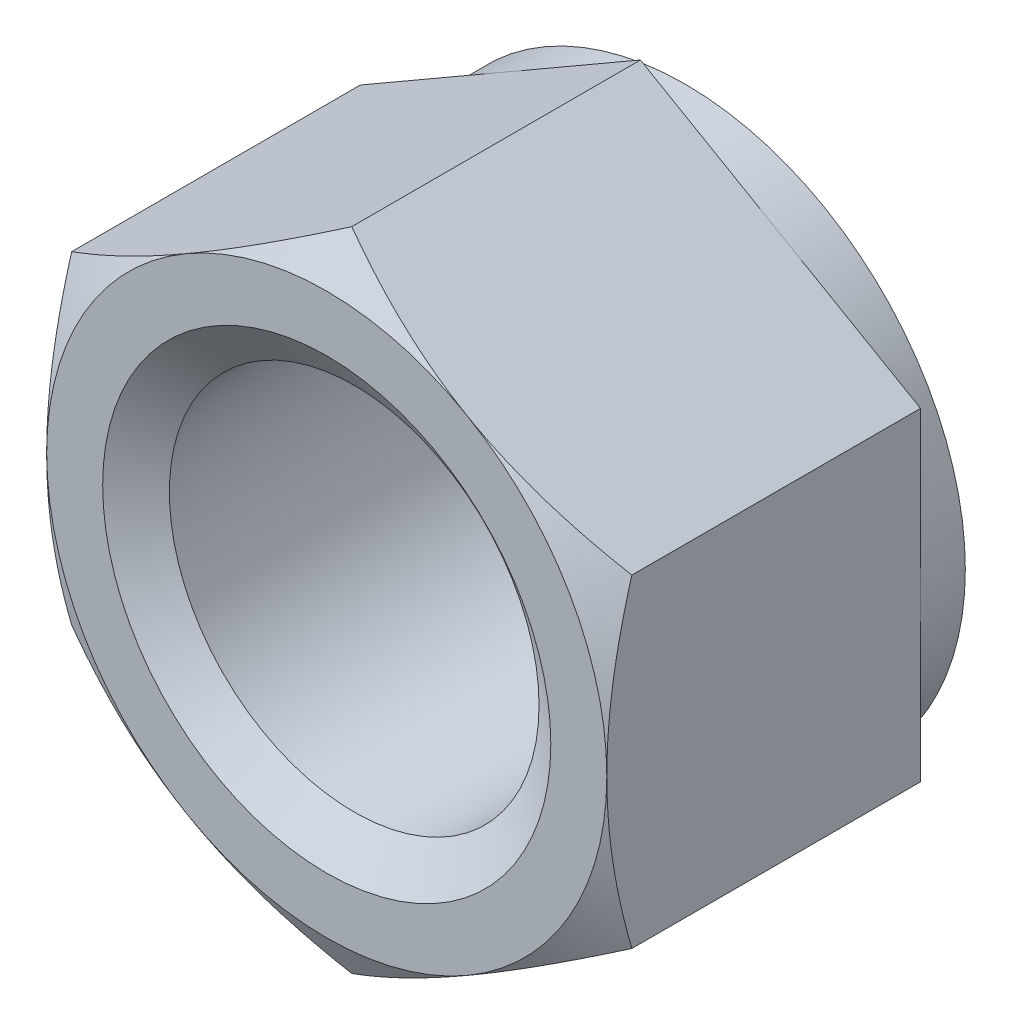
ISO-10303-21;
HEADER;
FILE_DESCRIPTION(('STEP AP214'),'2;1');
FILE_NAME('part.step','',(''),(''),'','','');
FILE_SCHEMA(('AUTOMOTIVE_DESIGN { 1 0 10303 214 1 1 1 1 }'));
ENDSEC;
DATA;
#1=APPLICATION_CONTEXT('core data for automotive mechanical design processes');
#2=APPLICATION_PROTOCOL_DEFINITION('international standard','automotive_design',2000,#1);
#3=PRODUCT_CONTEXT('',#1,'mechanical');
#4=PRODUCT('Part','Part','',(#3));
#5=PRODUCT_RELATED_PRODUCT_CATEGORY('part','',(#4));
#6=PRODUCT_DEFINITION_FORMATION('','',#4);
#7=PRODUCT_DEFINITION_CONTEXT('part definition',#1,'design');
#8=PRODUCT_DEFINITION('design','',#6,#7);
#9=PRODUCT_DEFINITION_SHAPE('','',#8);
#10=(LENGTH_UNIT() NAMED_UNIT(*) SI_UNIT(.MILLI.,.METRE.));
#11=(NAMED_UNIT(*) PLANE_ANGLE_UNIT() SI_UNIT($,.RADIAN.));
#12=(NAMED_UNIT(*) SI_UNIT($,.STERADIAN.) SOLID_ANGLE_UNIT());
#13=UNCERTAINTY_MEASURE_WITH_UNIT(LENGTH_MEASURE(1.E-05),#10,'distance_accuracy_value','');
#14=(GEOMETRIC_REPRESENTATION_CONTEXT(3) GLOBAL_UNCERTAINTY_ASSIGNED_CONTEXT((#13)) GLOBAL_UNIT_ASSIGNED_CONTEXT((#10,
#11,#12)) REPRESENTATION_CONTEXT('',''));
#15=CARTESIAN_POINT('',(0.,0.,0.));
#16=DIRECTION('',(0.,0.,1.));
#17=DIRECTION('',(1.,0.,0.));
#18=AXIS2_PLACEMENT_3D('',#15,#16,#17);
#19=CARTESIAN_POINT('',(0.,0.,-3.2));
#20=DIRECTION('',(0.,0.,1.));
#21=DIRECTION('',(1.,0.,0.));
#22=AXIS2_PLACEMENT_3D('',#19,#20,#21);
#23=CYLINDRICAL_SURFACE('',#22,1.65);
#24=CARTESIAN_POINT('',(0.,0.,-0.245072638373399));
#25=DIRECTION('',(0.,0.,1.));
#26=DIRECTION('',(1.,0.,0.));
#27=AXIS2_PLACEMENT_3D('',#24,#25,#26);
#28=CIRCLE('',#27,1.65);
#29=CARTESIAN_POINT('',(1.65,0.,-0.245072638373399));
#30=VERTEX_POINT('',#29);
#31=EDGE_CURVE('E152',#30,#30,#28,.F.);
#32=ORIENTED_EDGE('',*,*,#31,.F.);
#33=EDGE_LOOP('',(#32));
#34=FACE_BOUND('',#33,.T.);
#35=CARTESIAN_POINT('',(0.,0.,-2.9295273616266));
#36=DIRECTION('',(0.,0.,-1.));
#37=DIRECTION('',(-1.,0.,0.));
#38=AXIS2_PLACEMENT_3D('',#35,#36,#37);
#39=CIRCLE('',#38,1.65);
#40=CARTESIAN_POINT('',(-1.65,0.,-2.9295273616266));
#41=VERTEX_POINT('',#40);
#42=EDGE_CURVE('E40',#41,#41,#39,.F.);
#43=ORIENTED_EDGE('',*,*,#42,.F.);
#44=EDGE_LOOP('',(#43));
#45=FACE_BOUND('',#44,.T.);
#46=ADVANCED_FACE('F35',(#34,#45),#23,.F.);
#47=CARTESIAN_POINT('',(0.,2.88675134594813,-3.2));
#48=DIRECTION('',(-0.500000000000001,0.866025403784438,0.));
#49=DIRECTION('',(-0.866025403784438,-0.500000000000001,0.));
#50=AXIS2_PLACEMENT_3D('',#47,#48,#49);
#51=PLANE('',#50);
#52=DIRECTION('',(0.,0.,1.));
#53=VECTOR('',#52,1.);
#54=CARTESIAN_POINT('',(-2.5,1.44337567297406,-3.2));
#55=LINE('',#54,#53);
#56=CARTESIAN_POINT('',(-2.5,1.44337567297406,-2.8));
#57=VERTEX_POINT('',#56);
#58=CARTESIAN_POINT('',(-2.5,1.44337567297406,-0.223290993692604));
#59=VERTEX_POINT('',#58);
#60=EDGE_CURVE('E287',#57,#59,#55,.T.);
#61=ORIENTED_EDGE('',*,*,#60,.T.);
#62=CARTESIAN_POINT('',(-2.5002,1.44326020292022,-0.223357664359109));
#63=CARTESIAN_POINT('',(-2.39033676526513,1.50668977106845,-0.186721620107626));
#64=CARTESIAN_POINT('',(-2.27952520010347,1.57066685804385,-0.153402218965056));
#65=CARTESIAN_POINT('',(-2.05598316653395,1.69972891130041,-0.0952422855578577));
#66=CARTESIAN_POINT('',(-1.94324872547161,1.7648161711947,-0.0704223291477381));
#67=CARTESIAN_POINT('',(-1.71917700612473,1.8941840386774,-0.0317856514410518));
#68=CARTESIAN_POINT('',(-1.60787420823262,1.95844473900197,-0.0177117961856388));
#69=CARTESIAN_POINT('',(-1.38474477253167,2.08726857876804,-0.000909152352750169));
#70=CARTESIAN_POINT('',(-1.27291894598577,2.15183124982667,0.00183354879637346));
#71=CARTESIAN_POINT('',(-1.06395802444848,2.27247489412634,-0.00386576000805375));
#72=CARTESIAN_POINT('',(-0.966791682442269,2.32857390783979,-0.0109083943818622));
#73=CARTESIAN_POINT('',(-0.773092050288998,2.44040644260542,-0.0332314191249434));
#74=CARTESIAN_POINT('',(-0.676559430340268,2.4961395767184,-0.0485194384402682));
#75=CARTESIAN_POINT('',(-0.482460278259524,2.60820277442169,-0.0867390938444218));
#76=CARTESIAN_POINT('',(-0.384918318217859,2.66451865130903,-0.109832776125519));
#77=CARTESIAN_POINT('',(-0.191289391923915,2.77631036402774,-0.162246656577916));
#78=CARTESIAN_POINT('',(-0.0951999441138235,2.83178763258718,-0.191554535624551));
#79=CARTESIAN_POINT('',(0.000200000000000591,2.88686681600197,-0.223357664359111));
#80=B_SPLINE_CURVE_WITH_KNOTS('',3,(#62,#63,#64,#65,#66,#67,#68,#69,#70,#71,#72,#73,#74,#75,#76,
#77,#78,#79),.UNSPECIFIED.,.F.,.F.,(4,2,2,2,2,2,2,2,4),(0.,0.396285827362227,0.793524330152052,
1.18093086852114,1.56786160134475,1.90479741793733,2.24204551660463,2.58677531536756,
2.93082800105257),.UNSPECIFIED.);
#81=CARTESIAN_POINT('',(-1.25,2.1650635094611,0.));
#82=VERTEX_POINT('',#81);
#83=EDGE_CURVE('E59',#59,#82,#80,.T.);
#84=ORIENTED_EDGE('',*,*,#83,.T.);
#85=CARTESIAN_POINT('',(0.,2.88675134594813,-0.223290993692604));
#86=VERTEX_POINT('',#85);
#87=EDGE_CURVE('E166',#82,#86,#80,.T.);
#88=ORIENTED_EDGE('',*,*,#87,.T.);
#89=DIRECTION('',(0.,0.,1.));
#90=VECTOR('',#89,1.);
#91=CARTESIAN_POINT('',(0.,2.88675134594813,-3.2));
#92=LINE('',#91,#90);
#93=CARTESIAN_POINT('',(0.,2.88675134594813,-2.8));
#94=VERTEX_POINT('',#93);
#95=EDGE_CURVE('E275',#94,#86,#92,.T.);
#96=ORIENTED_EDGE('',*,*,#95,.F.);
#97=DIRECTION('',(-0.866025403784438,-0.500000000000001,0.));
#98=VECTOR('',#97,1.);
#99=CARTESIAN_POINT('',(0.,2.88675134594813,-2.8));
#100=LINE('',#99,#98);
#101=CARTESIAN_POINT('',(-1.25,2.1650635094611,-2.8));
#102=VERTEX_POINT('',#101);
#103=EDGE_CURVE('E263',#94,#102,#100,.T.);
#104=ORIENTED_EDGE('',*,*,#103,.T.);
#105=EDGE_CURVE('E259',#102,#57,#100,.T.);
#106=ORIENTED_EDGE('',*,*,#105,.T.);
#107=EDGE_LOOP('',(#61,#84,#88,#96,#104,#106));
#108=FACE_BOUND('',#107,.T.);
#109=ADVANCED_FACE('F37',(#108),#51,.T.);
#110=CARTESIAN_POINT('',(2.5,1.44337567297406,-3.2));
#111=DIRECTION('',(0.500000000000001,0.866025403784438,0.));
#112=DIRECTION('',(-0.866025403784438,0.500000000000001,0.));
#113=AXIS2_PLACEMENT_3D('',#110,#111,#112);
#114=PLANE('',#113);
#115=ORIENTED_EDGE('',*,*,#95,.T.);
#116=CARTESIAN_POINT('',(-0.000199999999999822,2.88686681600197,-0.223357664359111));
#117=CARTESIAN_POINT('',(0.109663234734871,2.82343724785375,-0.186721620107628));
#118=CARTESIAN_POINT('',(0.220474799896526,2.75946016087834,-0.153402218965058));
#119=CARTESIAN_POINT('',(0.44401683346605,2.63039810762178,-0.0952422855578595));
#120=CARTESIAN_POINT('',(0.556751274528389,2.5653108477275,-0.0704223291477398));
#121=CARTESIAN_POINT('',(0.780822993875269,2.43594298024479,-0.031785651441053));
#122=CARTESIAN_POINT('',(0.892125791767377,2.37168227992023,-0.0177117961856397));
#123=CARTESIAN_POINT('',(1.11525522746833,2.24285844015415,-0.000909152352750471));
#124=CARTESIAN_POINT('',(1.22708105401423,2.17829576909553,0.00183354879637335));
#125=CARTESIAN_POINT('',(1.43604197555152,2.05765212479586,-0.00386576000805353));
#126=CARTESIAN_POINT('',(1.53320831755773,2.0015531110824,-0.0109083943818618));
#127=CARTESIAN_POINT('',(1.726907949711,1.88972057631678,-0.0332314191249426));
#128=CARTESIAN_POINT('',(1.82344056965973,1.8339874422038,-0.0485194384402671));
#129=CARTESIAN_POINT('',(2.01753972174048,1.7219242445005,-0.0867390938444202));
#130=CARTESIAN_POINT('',(2.11508168178214,1.66560836761316,-0.109832776125517));
#131=CARTESIAN_POINT('',(2.30871060807609,1.55381665489445,-0.162246656577913));
#132=CARTESIAN_POINT('',(2.40480005588618,1.49833938633502,-0.191554535624549));
#133=CARTESIAN_POINT('',(2.5002,1.44326020292022,-0.223357664359109));
#134=B_SPLINE_CURVE_WITH_KNOTS('',3,(#116,#117,#118,#119,#120,#121,#122,#123,#124,#125,#126,
#127,#128,#129,#130,#131,#132,#133),.UNSPECIFIED.,.F.,.F.,(4,2,2,2,2,2,2,2,4),(0.,
0.396285827362227,0.793524330152052,1.18093086852114,1.56786160134476,1.90479741793733,
2.24204551660463,2.58677531536756,2.93082800105257),.UNSPECIFIED.);
#135=CARTESIAN_POINT('',(1.25,2.1650635094611,0.));
#136=VERTEX_POINT('',#135);
#137=EDGE_CURVE('E163',#86,#136,#134,.T.);
#138=ORIENTED_EDGE('',*,*,#137,.T.);
#139=CARTESIAN_POINT('',(2.5,1.44337567297407,-0.223290993692604));
#140=VERTEX_POINT('',#139);
#141=EDGE_CURVE('E146',#136,#140,#134,.T.);
#142=ORIENTED_EDGE('',*,*,#141,.T.);
#143=DIRECTION('',(0.,0.,1.));
#144=VECTOR('',#143,1.);
#145=CARTESIAN_POINT('',(2.5,1.44337567297406,-3.2));
#146=LINE('',#145,#144);
#147=CARTESIAN_POINT('',(2.5,1.44337567297406,-2.8));
#148=VERTEX_POINT('',#147);
#149=EDGE_CURVE('E162',#148,#140,#146,.T.);
#150=ORIENTED_EDGE('',*,*,#149,.F.);
#151=DIRECTION('',(-0.866025403784438,0.500000000000001,0.));
#152=VECTOR('',#151,1.);
#153=CARTESIAN_POINT('',(2.5,1.44337567297406,-2.8));
#154=LINE('',#153,#152);
#155=CARTESIAN_POINT('',(1.25,2.1650635094611,-2.8));
#156=VERTEX_POINT('',#155);
#157=EDGE_CURVE('E271',#148,#156,#154,.T.);
#158=ORIENTED_EDGE('',*,*,#157,.T.);
#159=EDGE_CURVE('E267',#156,#94,#154,.T.);
#160=ORIENTED_EDGE('',*,*,#159,.T.);
#161=EDGE_LOOP('',(#115,#138,#142,#150,#158,#160));
#162=FACE_BOUND('',#161,.T.);
#163=ADVANCED_FACE('F235',(#162),#114,.T.);
#164=CARTESIAN_POINT('',(2.5,1.44337567297406,-3.2));
#165=DIRECTION('',(-1.,0.,0.));
#166=DIRECTION('',(0.,0.,1.));
#167=AXIS2_PLACEMENT_3D('',#164,#165,#166);
#168=PLANE('',#167);
#169=CARTESIAN_POINT('',(2.5,-3.82804499372433,-1.1963167632754));
#170=CARTESIAN_POINT('',(2.5,-3.71828085649173,-1.14327266922931));
#171=CARTESIAN_POINT('',(2.5,-3.60825720059554,-1.09075587737962));
#172=CARTESIAN_POINT('',(2.5,-3.38755052986222,-0.987078216748228));
#173=CARTESIAN_POINT('',(2.5,-3.27686740487455,-0.935917582729521));
#174=CARTESIAN_POINT('',(2.5,-3.05410357303959,-0.834984039411599));
#175=CARTESIAN_POINT('',(2.5,-2.94201849305851,-0.785220746914399));
#176=CARTESIAN_POINT('',(2.5,-2.7169270921704,-0.687831615887686));
#177=CARTESIAN_POINT('',(2.5,-2.60392081964711,-0.640205665942513));
#178=CARTESIAN_POINT('',(2.5,-2.37540441715611,-0.547094156496477));
#179=CARTESIAN_POINT('',(2.5,-2.25988058014231,-0.501642052634904));
#180=CARTESIAN_POINT('',(2.5,-2.02747029246855,-0.414297644349638));
#181=CARTESIAN_POINT('',(2.5,-1.91058369184876,-0.372405735979066));
#182=CARTESIAN_POINT('',(2.5,-1.67550198908607,-0.293307342769302));
#183=CARTESIAN_POINT('',(2.5,-1.5573102732053,-0.256090896739899));
#184=CARTESIAN_POINT('',(2.5,-1.31924659147407,-0.187552097840317));
#185=CARTESIAN_POINT('',(2.5,-1.19937516991093,-0.15622788104797));
#186=CARTESIAN_POINT('',(2.5,-0.957870204363751,-0.100994246846276));
#187=CARTESIAN_POINT('',(2.5,-0.836236200197812,-0.0770868037228377));
#188=CARTESIAN_POINT('',(2.5,-0.591501703670348,-0.0382963974514647));
#189=CARTESIAN_POINT('',(2.5,-0.46840121001236,-0.023413442282312));
#190=CARTESIAN_POINT('',(2.5,-0.222157493517465,-0.00398863321839782));
#191=CARTESIAN_POINT('',(2.5,-0.0990195694337582,0.000618687975650794));
#192=CARTESIAN_POINT('',(2.5,0.147170053504667,-0.000752541484247247));
#193=CARTESIAN_POINT('',(2.5,0.270221766445127,-0.00672834425959419));
#194=CARTESIAN_POINT('',(2.5,0.480350397015946,-0.0255492091334942));
#195=CARTESIAN_POINT('',(2.5,0.567659136488635,-0.0359433100274436));
#196=CARTESIAN_POINT('',(2.5,0.741602181646856,-0.0613833814666823));
#197=CARTESIAN_POINT('',(2.5,0.82823637875633,-0.0764300856615289));
#198=CARTESIAN_POINT('',(2.5,1.08705653408106,-0.127759419343894));
#199=CARTESIAN_POINT('',(2.5,1.25802931580451,-0.170218054015721));
#200=CARTESIAN_POINT('',(2.5,1.51386408134077,-0.243447724573252));
#201=CARTESIAN_POINT('',(2.5,1.60005960225961,-0.269821213632273));
#202=CARTESIAN_POINT('',(2.5,1.77155099438377,-0.325177862642352));
#203=CARTESIAN_POINT('',(2.5,1.85684744139723,-0.354159222616821));
#204=CARTESIAN_POINT('',(2.5,2.02618400322713,-0.41412856198768));
#205=CARTESIAN_POINT('',(2.5,2.11022848716774,-0.445104328595938));
#206=CARTESIAN_POINT('',(2.5,2.27766538220571,-0.50887397111919));
#207=CARTESIAN_POINT('',(2.5,2.36105751399617,-0.541668581852107));
#208=CARTESIAN_POINT('',(2.5,2.44414811866678,-0.575193129088621));
#209=B_SPLINE_CURVE_WITH_KNOTS('',3,(#169,#170,#171,#172,#173,#174,#175,#176,#177,#178,#179,
#180,#181,#182,#183,#184,#185,#186,#187,#188,#189,#190,#191,#192,#193,#194,#195,#196,#197,#198,
#199,#200,#201,#202,#203,#204,#205,#206,#207,#208),.UNSPECIFIED.,.F.,.F.,(4,2,2,2,2,2,2,2,2,2,2,
2,2,2,2,2,2,2,2,4),(0.,0.365732370332669,0.731527644124543,1.09941621653744,1.46728558928017,
1.83967125623427,2.21209829506681,2.58371790436,2.95521975869669,3.32682041917403,
3.69842140819258,4.06764803658773,4.43677881037429,4.70042588015951,4.96411454456775,
5.49188432099894,5.76228301186056,6.03249648197686,6.30118900914357,6.56999089095293),.UNSPECIFIED.);
#210=CARTESIAN_POINT('',(2.5,-1.44337567297407,-0.223290993692604));
#211=VERTEX_POINT('',#210);
#212=CARTESIAN_POINT('',(2.5,0.,0.));
#213=VERTEX_POINT('',#212);
#214=EDGE_CURVE('E127',#211,#213,#209,.T.);
#215=ORIENTED_EDGE('',*,*,#214,.F.);
#216=DIRECTION('',(0.,0.,1.));
#217=VECTOR('',#216,1.);
#218=CARTESIAN_POINT('',(2.5,-1.44337567297407,-3.2));
#219=LINE('',#218,#217);
#220=CARTESIAN_POINT('',(2.5,-1.44337567297407,-2.8));
#221=VERTEX_POINT('',#220);
#222=EDGE_CURVE('E280',#221,#211,#219,.T.);
#223=ORIENTED_EDGE('',*,*,#222,.F.);
#224=DIRECTION('',(0.,-1.,0.));
#225=VECTOR('',#224,1.);
#226=CARTESIAN_POINT('',(2.5,1.44337567297406,-2.8));
#227=LINE('',#226,#225);
#228=CARTESIAN_POINT('',(2.5,0.,-2.8));
#229=VERTEX_POINT('',#228);
#230=EDGE_CURVE('E272',#229,#221,#227,.T.);
#231=ORIENTED_EDGE('',*,*,#230,.F.);
#232=EDGE_CURVE('E274',#148,#229,#227,.T.);
#233=ORIENTED_EDGE('',*,*,#232,.F.);
#234=ORIENTED_EDGE('',*,*,#149,.T.);
#235=EDGE_CURVE('E140',#213,#140,#209,.T.);
#236=ORIENTED_EDGE('',*,*,#235,.F.);
#237=EDGE_LOOP('',(#215,#223,#231,#233,#234,#236));
#238=FACE_BOUND('',#237,.T.);
#239=ADVANCED_FACE('F159',(#238),#168,.F.);
#240=CARTESIAN_POINT('',(0.,-2.88675134594814,-3.2));
#241=DIRECTION('',(0.500000000000001,-0.866025403784438,0.));
#242=DIRECTION('',(0.866025403784438,0.500000000000001,0.));
#243=AXIS2_PLACEMENT_3D('',#240,#241,#242);
#244=PLANE('',#243);
#245=ORIENTED_EDGE('',*,*,#222,.T.);
#246=CARTESIAN_POINT('',(2.5002,-1.44326020292023,-0.223357664359111));
#247=CARTESIAN_POINT('',(2.39033676526513,-1.50668977106845,-0.186721620107628));
#248=CARTESIAN_POINT('',(2.27952520010347,-1.57066685804386,-0.153402218965058));
#249=CARTESIAN_POINT('',(2.05598316653395,-1.69972891130042,-0.09524228555786));
#250=CARTESIAN_POINT('',(1.94324872547161,-1.7648161711947,-0.0704223291477405));
#251=CARTESIAN_POINT('',(1.71917700612473,-1.89418403867741,-0.0317856514410544));
#252=CARTESIAN_POINT('',(1.60787420823262,-1.95844473900197,-0.0177117961856415));
#253=CARTESIAN_POINT('',(1.38474477253167,-2.08726857876805,-0.000909152352753151));
#254=CARTESIAN_POINT('',(1.27291894598577,-2.15183124982667,0.00183354879637023));
#255=CARTESIAN_POINT('',(1.06395802444848,-2.27247489412634,-0.00386576000805714));
#256=CARTESIAN_POINT('',(0.966791682442268,-2.3285739078398,-0.0109083943818655));
#257=CARTESIAN_POINT('',(0.773092050288997,-2.44040644260542,-0.0332314191249467));
#258=CARTESIAN_POINT('',(0.676559430340267,-2.4961395767184,-0.0485194384402715));
#259=CARTESIAN_POINT('',(0.482460278259523,-2.6082027744217,-0.0867390938444253));
#260=CARTESIAN_POINT('',(0.384918318217859,-2.66451865130904,-0.109832776125522));
#261=CARTESIAN_POINT('',(0.191289391923915,-2.77631036402775,-0.162246656577919));
#262=CARTESIAN_POINT('',(0.0951999441138237,-2.83178763258718,-0.191554535624555));
#263=CARTESIAN_POINT('',(-0.000200000000000148,-2.88686681600198,-0.223357664359115));
#264=B_SPLINE_CURVE_WITH_KNOTS('',3,(#246,#247,#248,#249,#250,#251,#252,#253,#254,#255,#256,
#257,#258,#259,#260,#261,#262,#263),.UNSPECIFIED.,.F.,.F.,(4,2,2,2,2,2,2,2,4),(0.,
0.396285827362227,0.793524330152052,1.18093086852114,1.56786160134476,1.90479741793733,
2.24204551660463,2.58677531536756,2.93082800105257),.UNSPECIFIED.);
#265=CARTESIAN_POINT('',(1.25,-2.1650635094611,0.));
#266=VERTEX_POINT('',#265);
#267=EDGE_CURVE('E134',#211,#266,#264,.T.);
#268=ORIENTED_EDGE('',*,*,#267,.T.);
#269=CARTESIAN_POINT('',(0.,-2.88675134594813,-0.223290993692604));
#270=VERTEX_POINT('',#269);
#271=EDGE_CURVE('E173',#266,#270,#264,.T.);
#272=ORIENTED_EDGE('',*,*,#271,.T.);
#273=DIRECTION('',(0.,0.,1.));
#274=VECTOR('',#273,1.);
#275=CARTESIAN_POINT('',(0.,-2.88675134594814,-3.2));
#276=LINE('',#275,#274);
#277=CARTESIAN_POINT('',(0.,-2.88675134594814,-2.8));
#278=VERTEX_POINT('',#277);
#279=EDGE_CURVE('E282',#278,#270,#276,.T.);
#280=ORIENTED_EDGE('',*,*,#279,.F.);
#281=DIRECTION('',(0.866025403784438,0.500000000000001,0.));
#282=VECTOR('',#281,1.);
#283=CARTESIAN_POINT('',(0.,-2.88675134594814,-2.8));
#284=LINE('',#283,#282);
#285=CARTESIAN_POINT('',(1.25000000000001,-2.1650635094611,-2.8));
#286=VERTEX_POINT('',#285);
#287=EDGE_CURVE('E264',#278,#286,#284,.T.);
#288=ORIENTED_EDGE('',*,*,#287,.T.);
#289=EDGE_CURVE('E268',#286,#221,#284,.T.);
#290=ORIENTED_EDGE('',*,*,#289,.T.);
#291=EDGE_LOOP('',(#245,#268,#272,#280,#288,#290));
#292=FACE_BOUND('',#291,.T.);
#293=ADVANCED_FACE('F216',(#292),#244,.T.);
#294=CARTESIAN_POINT('',(-2.5,-1.44337567297407,-3.2));
#295=DIRECTION('',(-0.500000000000001,-0.866025403784438,0.));
#296=DIRECTION('',(0.866025403784438,-0.500000000000001,0.));
#297=AXIS2_PLACEMENT_3D('',#294,#295,#296);
#298=PLANE('',#297);
#299=ORIENTED_EDGE('',*,*,#279,.T.);
#300=CARTESIAN_POINT('',(0.000199999999999937,-2.88686681600198,-0.223357664359114));
#301=CARTESIAN_POINT('',(-0.109663234734871,-2.82343724785375,-0.186721620107632));
#302=CARTESIAN_POINT('',(-0.220474799896526,-2.75946016087835,-0.153402218965061));
#303=CARTESIAN_POINT('',(-0.444016833466051,-2.63039810762179,-0.0952422855578624));
#304=CARTESIAN_POINT('',(-0.55675127452839,-2.5653108477275,-0.0704223291477428));
#305=CARTESIAN_POINT('',(-0.780822993875271,-2.4359429802448,-0.0317856514410559));
#306=CARTESIAN_POINT('',(-0.892125791767379,-2.37168227992023,-0.0177117961856424));
#307=CARTESIAN_POINT('',(-1.11525522746834,-2.24285844015415,-0.000909152352753268));
#308=CARTESIAN_POINT('',(-1.22708105401423,-2.17829576909553,0.00183354879637032));
#309=CARTESIAN_POINT('',(-1.43604197555152,-2.05765212479586,-0.00386576000805651));
#310=CARTESIAN_POINT('',(-1.53320831755773,-2.0015531110824,-0.0109083943818645));
#311=CARTESIAN_POINT('',(-1.726907949711,-1.88972057631678,-0.0332314191249451));
#312=CARTESIAN_POINT('',(-1.82344056965973,-1.8339874422038,-0.0485194384402697));
#313=CARTESIAN_POINT('',(-2.01753972174048,-1.72192424450051,-0.0867390938444228));
#314=CARTESIAN_POINT('',(-2.11508168178214,-1.66560836761317,-0.10983277612552));
#315=CARTESIAN_POINT('',(-2.30871060807609,-1.55381665489446,-0.162246656577916));
#316=CARTESIAN_POINT('',(-2.40480005588618,-1.49833938633502,-0.191554535624551));
#317=CARTESIAN_POINT('',(-2.5002,-1.44326020292023,-0.22335766435911));
#318=B_SPLINE_CURVE_WITH_KNOTS('',3,(#300,#301,#302,#303,#304,#305,#306,#307,#308,#309,#310,
#311,#312,#313,#314,#315,#316,#317),.UNSPECIFIED.,.F.,.F.,(4,2,2,2,2,2,2,2,4),(0.,
0.396285827362229,0.793524330152054,1.18093086852114,1.56786160134476,1.90479741793734,
2.24204551660463,2.58677531536756,2.93082800105257),.UNSPECIFIED.);
#319=CARTESIAN_POINT('',(-1.25,-2.1650635094611,0.));
#320=VERTEX_POINT('',#319);
#321=EDGE_CURVE('E210',#270,#320,#318,.T.);
#322=ORIENTED_EDGE('',*,*,#321,.T.);
#323=CARTESIAN_POINT('',(-2.5,-1.44337567297407,-0.223290993692604));
#324=VERTEX_POINT('',#323);
#325=EDGE_CURVE('E203',#320,#324,#318,.T.);
#326=ORIENTED_EDGE('',*,*,#325,.T.);
#327=DIRECTION('',(0.,0.,1.));
#328=VECTOR('',#327,1.);
#329=CARTESIAN_POINT('',(-2.5,-1.44337567297407,-3.2));
#330=LINE('',#329,#328);
#331=CARTESIAN_POINT('',(-2.5,-1.44337567297407,-2.8));
#332=VERTEX_POINT('',#331);
#333=EDGE_CURVE('E285',#332,#324,#330,.T.);
#334=ORIENTED_EDGE('',*,*,#333,.F.);
#335=DIRECTION('',(0.866025403784438,-0.500000000000001,0.));
#336=VECTOR('',#335,1.);
#337=CARTESIAN_POINT('',(-2.5,-1.44337567297407,-2.8));
#338=LINE('',#337,#336);
#339=CARTESIAN_POINT('',(-1.25000000000001,-2.1650635094611,-2.8));
#340=VERTEX_POINT('',#339);
#341=EDGE_CURVE('E254',#332,#340,#338,.T.);
#342=ORIENTED_EDGE('',*,*,#341,.T.);
#343=EDGE_CURVE('E260',#340,#278,#338,.T.);
#344=ORIENTED_EDGE('',*,*,#343,.T.);
#345=EDGE_LOOP('',(#299,#322,#326,#334,#342,#344));
#346=FACE_BOUND('',#345,.T.);
#347=ADVANCED_FACE('F212',(#346),#298,.T.);
#348=CARTESIAN_POINT('',(-2.5,1.44337567297406,-3.2));
#349=DIRECTION('',(-1.,0.,0.));
#350=DIRECTION('',(0.,0.,1.));
#351=AXIS2_PLACEMENT_3D('',#348,#349,#350);
#352=PLANE('',#351);
#353=ORIENTED_EDGE('',*,*,#333,.T.);
#354=CARTESIAN_POINT('',(-2.5,-3.82804499372433,-1.1963167632754));
#355=CARTESIAN_POINT('',(-2.5,-3.71828085649173,-1.14327266922931));
#356=CARTESIAN_POINT('',(-2.5,-3.60825720059554,-1.09075587737962));
#357=CARTESIAN_POINT('',(-2.5,-3.38755052986222,-0.987078216748228));
#358=CARTESIAN_POINT('',(-2.5,-3.27686740487455,-0.935917582729521));
#359=CARTESIAN_POINT('',(-2.5,-3.05410357303959,-0.834984039411599));
#360=CARTESIAN_POINT('',(-2.5,-2.94201849305851,-0.7852207469144));
#361=CARTESIAN_POINT('',(-2.5,-2.7169270921704,-0.687831615887687));
#362=CARTESIAN_POINT('',(-2.5,-2.60392081964711,-0.640205665942514));
#363=CARTESIAN_POINT('',(-2.5,-2.37540441715611,-0.547094156496477));
#364=CARTESIAN_POINT('',(-2.5,-2.25988058014231,-0.501642052634904));
#365=CARTESIAN_POINT('',(-2.5,-2.02747029246855,-0.414297644349638));
#366=CARTESIAN_POINT('',(-2.5,-1.91058369184876,-0.372405735979066));
#367=CARTESIAN_POINT('',(-2.5,-1.67550198908607,-0.293307342769302));
#368=CARTESIAN_POINT('',(-2.5,-1.5573102732053,-0.256090896739899));
#369=CARTESIAN_POINT('',(-2.5,-1.31924659147407,-0.187552097840317));
#370=CARTESIAN_POINT('',(-2.5,-1.19937516991093,-0.15622788104797));
#371=CARTESIAN_POINT('',(-2.5,-0.957870204363751,-0.100994246846276));
#372=CARTESIAN_POINT('',(-2.5,-0.836236200197811,-0.0770868037228378));
#373=CARTESIAN_POINT('',(-2.5,-0.591501703670347,-0.0382963974514647));
#374=CARTESIAN_POINT('',(-2.5,-0.46840121001236,-0.0234134422823117));
#375=CARTESIAN_POINT('',(-2.5,-0.222157493517465,-0.00398863321839758));
#376=CARTESIAN_POINT('',(-2.5,-0.0990195694337579,0.000618687975650855));
#377=CARTESIAN_POINT('',(-2.5,0.147170053504667,-0.000752541484247309));
#378=CARTESIAN_POINT('',(-2.5,0.270221766445127,-0.00672834425959422));
#379=CARTESIAN_POINT('',(-2.5,0.480350397015946,-0.0255492091334942));
#380=CARTESIAN_POINT('',(-2.5,0.567659136488635,-0.0359433100274436));
#381=CARTESIAN_POINT('',(-2.5,0.741602181646856,-0.0613833814666824));
#382=CARTESIAN_POINT('',(-2.5,0.828236378756331,-0.0764300856615291));
#383=CARTESIAN_POINT('',(-2.5,1.08705653408106,-0.127759419343895));
#384=CARTESIAN_POINT('',(-2.5,1.25802931580451,-0.170218054015721));
#385=CARTESIAN_POINT('',(-2.5,1.51386408134077,-0.243447724573252));
#386=CARTESIAN_POINT('',(-2.5,1.60005960225961,-0.269821213632273));
#387=CARTESIAN_POINT('',(-2.5,1.77155099438377,-0.325177862642352));
#388=CARTESIAN_POINT('',(-2.5,1.85684744139723,-0.354159222616821));
#389=CARTESIAN_POINT('',(-2.5,2.02618400322713,-0.41412856198768));
#390=CARTESIAN_POINT('',(-2.5,2.11022848716774,-0.445104328595939));
#391=CARTESIAN_POINT('',(-2.5,2.27766538220571,-0.50887397111919));
#392=CARTESIAN_POINT('',(-2.5,2.36105751399617,-0.541668581852107));
#393=CARTESIAN_POINT('',(-2.5,2.44414811866678,-0.575193129088622));
#394=B_SPLINE_CURVE_WITH_KNOTS('',3,(#354,#355,#356,#357,#358,#359,#360,#361,#362,#363,#364,
#365,#366,#367,#368,#369,#370,#371,#372,#373,#374,#375,#376,#377,#378,#379,#380,#381,#382,#383,
#384,#385,#386,#387,#388,#389,#390,#391,#392,#393),.UNSPECIFIED.,.F.,.F.,(4,2,2,2,2,2,2,2,2,2,2,
2,2,2,2,2,2,2,2,4),(0.,0.365732370332669,0.731527644124542,1.09941621653744,1.46728558928017,
1.83967125623427,2.21209829506681,2.58371790436,2.95521975869669,3.32682041917403,
3.69842140819258,4.06764803658773,4.43677881037429,4.70042588015951,4.96411454456775,
5.49188432099894,5.76228301186056,6.03249648197686,6.30118900914357,6.56999089095293),.UNSPECIFIED.);
#395=CARTESIAN_POINT('',(-2.5,0.,0.));
#396=VERTEX_POINT('',#395);
#397=EDGE_CURVE('E211',#324,#396,#394,.T.);
#398=ORIENTED_EDGE('',*,*,#397,.T.);
#399=EDGE_CURVE('E151',#396,#59,#394,.T.);
#400=ORIENTED_EDGE('',*,*,#399,.T.);
#401=ORIENTED_EDGE('',*,*,#60,.F.);
#402=DIRECTION('',(0.,-1.,0.));
#403=VECTOR('',#402,1.);
#404=CARTESIAN_POINT('',(-2.5,1.44337567297406,-2.8));
#405=LINE('',#404,#403);
#406=CARTESIAN_POINT('',(-2.5,0.,-2.8));
#407=VERTEX_POINT('',#406);
#408=EDGE_CURVE('E294',#57,#407,#405,.T.);
#409=ORIENTED_EDGE('',*,*,#408,.T.);
#410=EDGE_CURVE('E292',#407,#332,#405,.T.);
#411=ORIENTED_EDGE('',*,*,#410,.T.);
#412=EDGE_LOOP('',(#353,#398,#400,#401,#409,#411));
#413=FACE_BOUND('',#412,.T.);
#414=ADVANCED_FACE('F215',(#413),#352,.T.);
#415=CARTESIAN_POINT('',(0.,2.88675134594813,0.));
#416=DIRECTION('',(0.,0.,-1.));
#417=DIRECTION('',(-1.,0.,0.));
#418=AXIS2_PLACEMENT_3D('',#415,#416,#417);
#419=PLANE('',#418);
#420=CARTESIAN_POINT('',(0.,0.,0.));
#421=DIRECTION('',(0.,0.,1.));
#422=DIRECTION('',(1.,0.,0.));
#423=AXIS2_PLACEMENT_3D('',#420,#421,#422);
#424=CIRCLE('',#423,2.);
#425=CARTESIAN_POINT('',(2.,0.,0.));
#426=VERTEX_POINT('',#425);
#427=EDGE_CURVE('E297',#426,#426,#424,.T.);
#428=ORIENTED_EDGE('',*,*,#427,.F.);
#429=EDGE_LOOP('',(#428));
#430=FACE_BOUND('',#429,.T.);
#431=CARTESIAN_POINT('',(0.,0.,0.));
#432=DIRECTION('',(0.,0.,-1.));
#433=DIRECTION('',(-1.,0.,0.));
#434=AXIS2_PLACEMENT_3D('',#431,#432,#433);
#435=CIRCLE('',#434,2.5);
#436=EDGE_CURVE('E47',#82,#396,#435,.F.);
#437=ORIENTED_EDGE('',*,*,#436,.T.);
#438=EDGE_CURVE('E12',#396,#320,#435,.F.);
#439=ORIENTED_EDGE('',*,*,#438,.T.);
#440=EDGE_CURVE('E45',#320,#266,#435,.F.);
#441=ORIENTED_EDGE('',*,*,#440,.T.);
#442=EDGE_CURVE('E131',#266,#213,#435,.F.);
#443=ORIENTED_EDGE('',*,*,#442,.T.);
#444=CARTESIAN_POINT('',(0.,0.,0.));
#445=DIRECTION('',(0.,0.,1.));
#446=DIRECTION('',(1.,0.,0.));
#447=AXIS2_PLACEMENT_3D('',#444,#445,#446);
#448=CIRCLE('',#447,2.5);
#449=EDGE_CURVE('E143',#213,#136,#448,.T.);
#450=ORIENTED_EDGE('',*,*,#449,.T.);
#451=EDGE_CURVE('E157',#136,#82,#435,.F.);
#452=ORIENTED_EDGE('',*,*,#451,.T.);
#453=EDGE_LOOP('',(#437,#439,#441,#443,#450,#452));
#454=FACE_BOUND('',#453,.T.);
#455=ADVANCED_FACE('F155',(#430,#454),#419,.F.);
#456=CARTESIAN_POINT('',(0.,2.88675134594813,-3.2));
#457=DIRECTION('',(0.,0.,-1.));
#458=DIRECTION('',(-1.,0.,0.));
#459=AXIS2_PLACEMENT_3D('',#456,#457,#458);
#460=PLANE('',#459);
#461=CARTESIAN_POINT('',(0.,0.,-3.2));
#462=DIRECTION('',(0.,0.,-1.));
#463=DIRECTION('',(-1.,0.,0.));
#464=AXIS2_PLACEMENT_3D('',#461,#462,#463);
#465=CIRCLE('',#464,2.);
#466=CARTESIAN_POINT('',(-2.,0.,-3.2));
#467=VERTEX_POINT('',#466);
#468=EDGE_CURVE('E298',#467,#467,#465,.F.);
#469=ORIENTED_EDGE('',*,*,#468,.T.);
#470=EDGE_LOOP('',(#469));
#471=FACE_BOUND('',#470,.T.);
#472=CARTESIAN_POINT('',(0.,0.,-3.2));
#473=DIRECTION('',(0.,0.,-1.));
#474=DIRECTION('',(-1.,0.,0.));
#475=AXIS2_PLACEMENT_3D('',#472,#473,#474);
#476=CIRCLE('',#475,2.5);
#477=CARTESIAN_POINT('',(-2.5,0.,-3.2));
#478=VERTEX_POINT('',#477);
#479=EDGE_CURVE('E278',#478,#478,#476,.F.);
#480=ORIENTED_EDGE('',*,*,#479,.F.);
#481=EDGE_LOOP('',(#480));
#482=FACE_BOUND('',#481,.T.);
#483=ADVANCED_FACE('F225',(#471,#482),#460,.T.);
#484=CARTESIAN_POINT('',(0.,12.8867513459481,-2.8));
#485=DIRECTION('',(0.,0.,-1.));
#486=DIRECTION('',(-1.,0.,0.));
#487=AXIS2_PLACEMENT_3D('',#484,#485,#486);
#488=PLANE('',#487);
#489=ORIENTED_EDGE('',*,*,#232,.T.);
#490=CARTESIAN_POINT('',(0.,0.,-2.8));
#491=DIRECTION('',(0.,0.,1.));
#492=DIRECTION('',(1.,0.,0.));
#493=AXIS2_PLACEMENT_3D('',#490,#491,#492);
#494=CIRCLE('',#493,2.5);
#495=EDGE_CURVE('E251',#229,#156,#494,.T.);
#496=ORIENTED_EDGE('',*,*,#495,.T.);
#497=ORIENTED_EDGE('',*,*,#157,.F.);
#498=EDGE_LOOP('',(#489,#496,#497));
#499=FACE_BOUND('',#498,.T.);
#500=ADVANCED_FACE('F242',(#499),#488,.T.);
#501=ORIENTED_EDGE('',*,*,#230,.T.);
#502=ORIENTED_EDGE('',*,*,#289,.F.);
#503=EDGE_CURVE('E256',#286,#229,#494,.T.);
#504=ORIENTED_EDGE('',*,*,#503,.T.);
#505=EDGE_LOOP('',(#501,#502,#504));
#506=FACE_BOUND('',#505,.T.);
#507=ADVANCED_FACE('F444',(#506),#488,.T.);
#508=EDGE_CURVE('E255',#156,#102,#494,.T.);
#509=ORIENTED_EDGE('',*,*,#508,.T.);
#510=ORIENTED_EDGE('',*,*,#103,.F.);
#511=ORIENTED_EDGE('',*,*,#159,.F.);
#512=EDGE_LOOP('',(#509,#510,#511));
#513=FACE_BOUND('',#512,.T.);
#514=ADVANCED_FACE('F435',(#513),#488,.T.);
#515=ORIENTED_EDGE('',*,*,#343,.F.);
#516=EDGE_CURVE('E508',#340,#286,#494,.T.);
#517=ORIENTED_EDGE('',*,*,#516,.T.);
#518=ORIENTED_EDGE('',*,*,#287,.F.);
#519=EDGE_LOOP('',(#515,#517,#518));
#520=FACE_BOUND('',#519,.T.);
#521=ADVANCED_FACE('F426',(#520),#488,.T.);
#522=EDGE_CURVE('E522',#102,#407,#494,.T.);
#523=ORIENTED_EDGE('',*,*,#522,.T.);
#524=ORIENTED_EDGE('',*,*,#408,.F.);
#525=ORIENTED_EDGE('',*,*,#105,.F.);
#526=EDGE_LOOP('',(#523,#524,#525));
#527=FACE_BOUND('',#526,.T.);
#528=ADVANCED_FACE('F410',(#527),#488,.T.);
#529=CARTESIAN_POINT('',(0.,0.,0.));
#530=DIRECTION('',(0.,0.,1.));
#531=DIRECTION('',(1.,0.,0.));
#532=AXIS2_PLACEMENT_3D('',#529,#530,#531);
#533=CYLINDRICAL_SURFACE('',#532,2.5);
#534=ORIENTED_EDGE('',*,*,#479,.T.);
#535=EDGE_LOOP('',(#534));
#536=FACE_BOUND('',#535,.T.);
#537=ORIENTED_EDGE('',*,*,#508,.F.);
#538=ORIENTED_EDGE('',*,*,#495,.F.);
#539=ORIENTED_EDGE('',*,*,#503,.F.);
#540=ORIENTED_EDGE('',*,*,#516,.F.);
#541=EDGE_CURVE('E524',#407,#340,#494,.T.);
#542=ORIENTED_EDGE('',*,*,#541,.F.);
#543=ORIENTED_EDGE('',*,*,#522,.F.);
#544=EDGE_LOOP('',(#537,#538,#539,#540,#542,#543));
#545=FACE_BOUND('',#544,.T.);
#546=ADVANCED_FACE('F240',(#536,#545),#533,.T.);
#547=ORIENTED_EDGE('',*,*,#410,.F.);
#548=ORIENTED_EDGE('',*,*,#541,.T.);
#549=ORIENTED_EDGE('',*,*,#341,.F.);
#550=EDGE_LOOP('',(#547,#548,#549));
#551=FACE_BOUND('',#550,.T.);
#552=ADVANCED_FACE('F193',(#551),#488,.T.);
#553=CARTESIAN_POINT('',(0.,0.,0.));
#554=DIRECTION('',(0.,0.,-1.));
#555=DIRECTION('',(-1.,0.,0.));
#556=AXIS2_PLACEMENT_3D('',#553,#554,#555);
#557=CONICAL_SURFACE('',#556,2.5,1.0471975511966);
#558=ORIENTED_EDGE('',*,*,#399,.F.);
#559=ORIENTED_EDGE('',*,*,#436,.F.);
#560=ORIENTED_EDGE('',*,*,#83,.F.);
#561=EDGE_LOOP('',(#558,#559,#560));
#562=FACE_BOUND('',#561,.T.);
#563=ADVANCED_FACE('F372',(#562),#557,.T.);
#564=ORIENTED_EDGE('',*,*,#451,.F.);
#565=ORIENTED_EDGE('',*,*,#137,.F.);
#566=ORIENTED_EDGE('',*,*,#87,.F.);
#567=EDGE_LOOP('',(#564,#565,#566));
#568=FACE_BOUND('',#567,.T.);
#569=ADVANCED_FACE('F191',(#568),#557,.T.);
#570=ORIENTED_EDGE('',*,*,#449,.F.);
#571=ORIENTED_EDGE('',*,*,#235,.T.);
#572=ORIENTED_EDGE('',*,*,#141,.F.);
#573=EDGE_LOOP('',(#570,#571,#572));
#574=FACE_BOUND('',#573,.T.);
#575=ADVANCED_FACE('F144',(#574),#557,.T.);
#576=ORIENTED_EDGE('',*,*,#214,.T.);
#577=ORIENTED_EDGE('',*,*,#442,.F.);
#578=ORIENTED_EDGE('',*,*,#267,.F.);
#579=EDGE_LOOP('',(#576,#577,#578));
#580=FACE_BOUND('',#579,.T.);
#581=ADVANCED_FACE('F129',(#580),#557,.T.);
#582=ORIENTED_EDGE('',*,*,#440,.F.);
#583=ORIENTED_EDGE('',*,*,#321,.F.);
#584=ORIENTED_EDGE('',*,*,#271,.F.);
#585=EDGE_LOOP('',(#582,#583,#584));
#586=FACE_BOUND('',#585,.T.);
#587=ADVANCED_FACE('F190',(#586),#557,.T.);
#588=ORIENTED_EDGE('',*,*,#438,.F.);
#589=ORIENTED_EDGE('',*,*,#397,.F.);
#590=ORIENTED_EDGE('',*,*,#325,.F.);
#591=EDGE_LOOP('',(#588,#589,#590));
#592=FACE_BOUND('',#591,.T.);
#593=ADVANCED_FACE('F184',(#592),#557,.T.);
#594=CARTESIAN_POINT('',(0.,0.,-0.269579902210739));
#595=DIRECTION('',(0.,0.,1.));
#596=DIRECTION('',(1.,0.,0.));
#597=AXIS2_PLACEMENT_3D('',#594,#595,#596);
#598=CONICAL_SURFACE('',#597,1.615,0.95993108859688);
#599=ORIENTED_EDGE('',*,*,#427,.T.);
#600=EDGE_LOOP('',(#599));
#601=FACE_BOUND('',#600,.T.);
#602=ORIENTED_EDGE('',*,*,#31,.T.);
#603=EDGE_LOOP('',(#602));
#604=FACE_BOUND('',#603,.T.);
#605=ADVANCED_FACE('F189',(#601,#604),#598,.F.);
#606=CARTESIAN_POINT('',(0.,0.,-3.1746));
#607=DIRECTION('',(0.,0.,-1.));
#608=DIRECTION('',(-1.,0.,0.));
#609=AXIS2_PLACEMENT_3D('',#606,#607,#608);
#610=CONICAL_SURFACE('',#609,2.,0.95993108859688);
#611=CARTESIAN_POINT('',(0.,0.,-3.1746));
#612=DIRECTION('',(0.,0.,1.));
#613=DIRECTION('',(1.,0.,0.));
#614=AXIS2_PLACEMENT_3D('',#611,#612,#613);
#615=CIRCLE('',#614,2.);
#616=CARTESIAN_POINT('',(2.,0.,-3.1746));
#617=VERTEX_POINT('',#616);
#618=EDGE_CURVE('E300',#617,#617,#615,.T.);
#619=ORIENTED_EDGE('',*,*,#618,.F.);
#620=EDGE_LOOP('',(#619));
#621=FACE_BOUND('',#620,.T.);
#622=ORIENTED_EDGE('',*,*,#42,.T.);
#623=EDGE_LOOP('',(#622));
#624=FACE_BOUND('',#623,.T.);
#625=ADVANCED_FACE('F313',(#621,#624),#610,.F.);
#626=CARTESIAN_POINT('',(0.,0.,-25.0375057290932));
#627=DIRECTION('',(0.,0.,1.));
#628=DIRECTION('',(1.,0.,0.));
#629=AXIS2_PLACEMENT_3D('',#626,#627,#628);
#630=CYLINDRICAL_SURFACE('',#629,2.);
#631=ORIENTED_EDGE('',*,*,#468,.F.);
#632=EDGE_LOOP('',(#631));
#633=FACE_BOUND('',#632,.T.);
#634=ORIENTED_EDGE('',*,*,#618,.T.);
#635=EDGE_LOOP('',(#634));
#636=FACE_BOUND('',#635,.T.);
#637=ADVANCED_FACE('F317',(#633,#636),#630,.F.);
#638=CLOSED_SHELL('',(#46,#109,#163,#239,#293,#347,#414,#455,#483,#500,#507,#514,#521,#528,#546,
#552,#563,#569,#575,#581,#587,#593,#605,#625,#637));
#639=MANIFOLD_SOLID_BREP('B2',#638);
#640=ADVANCED_BREP_SHAPE_REPRESENTATION('',(#18,#639),#14);
#641=SHAPE_DEFINITION_REPRESENTATION(#9,#640);
ENDSEC;
END-ISO-10303-21;
